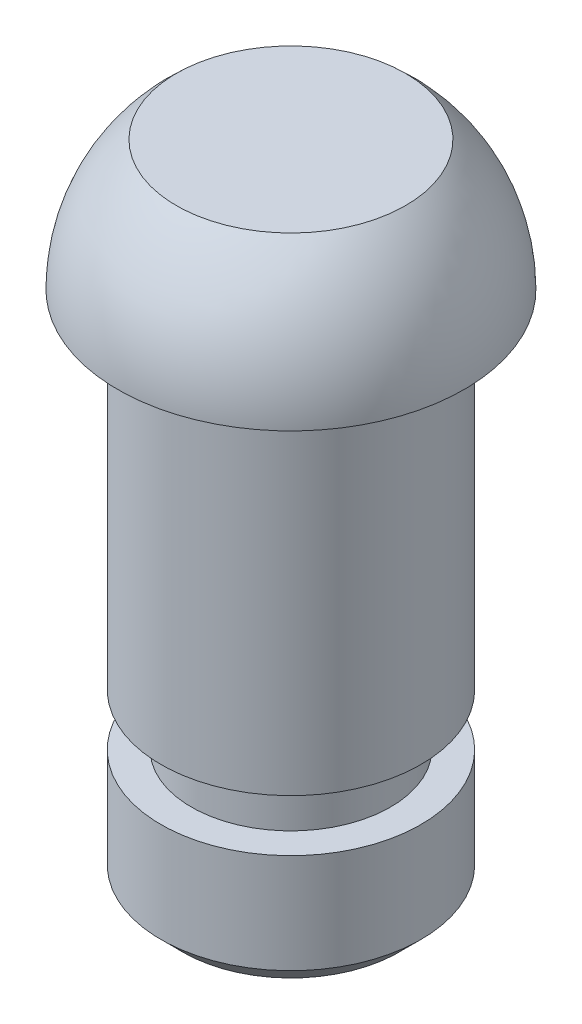
ISO-10303-21;
HEADER;
FILE_DESCRIPTION(('STEP AP214'),'2;1');
FILE_NAME('part.step','',(''),(''),'','','');
FILE_SCHEMA(('AUTOMOTIVE_DESIGN { 1 0 10303 214 1 1 1 1 }'));
ENDSEC;
DATA;
#1=APPLICATION_CONTEXT('core data for automotive mechanical design processes');
#2=APPLICATION_PROTOCOL_DEFINITION('international standard','automotive_design',2000,#1);
#3=PRODUCT_CONTEXT('',#1,'mechanical');
#4=PRODUCT('Part','Part','',(#3));
#5=PRODUCT_RELATED_PRODUCT_CATEGORY('part','',(#4));
#6=PRODUCT_DEFINITION_FORMATION('','',#4);
#7=PRODUCT_DEFINITION_CONTEXT('part definition',#1,'design');
#8=PRODUCT_DEFINITION('design','',#6,#7);
#9=PRODUCT_DEFINITION_SHAPE('','',#8);
#10=(LENGTH_UNIT() NAMED_UNIT(*) SI_UNIT(.MILLI.,.METRE.));
#11=(NAMED_UNIT(*) PLANE_ANGLE_UNIT() SI_UNIT($,.RADIAN.));
#12=(NAMED_UNIT(*) SI_UNIT($,.STERADIAN.) SOLID_ANGLE_UNIT());
#13=UNCERTAINTY_MEASURE_WITH_UNIT(LENGTH_MEASURE(1.E-05),#10,'distance_accuracy_value','');
#14=(GEOMETRIC_REPRESENTATION_CONTEXT(3) GLOBAL_UNCERTAINTY_ASSIGNED_CONTEXT((#13)) GLOBAL_UNIT_ASSIGNED_CONTEXT((#10,
#11,#12)) REPRESENTATION_CONTEXT('',''));
#15=CARTESIAN_POINT('',(0.,0.,0.));
#16=DIRECTION('',(0.,0.,1.));
#17=DIRECTION('',(1.,0.,0.));
#18=AXIS2_PLACEMENT_3D('',#15,#16,#17);
#19=CARTESIAN_POINT('',(1.5,0.,0.));
#20=DIRECTION('',(0.,-1.,0.));
#21=DIRECTION('',(0.,0.,-1.));
#22=AXIS2_PLACEMENT_3D('',#19,#20,#21);
#23=PLANE('',#22);
#24=CARTESIAN_POINT('',(0.,0.,0.));
#25=DIRECTION('',(0.,-1.,0.));
#26=DIRECTION('',(0.,0.,-1.));
#27=AXIS2_PLACEMENT_3D('',#24,#25,#26);
#28=CIRCLE('',#27,1.25);
#29=CARTESIAN_POINT('',(0.,0.,-1.25));
#30=VERTEX_POINT('',#29);
#31=EDGE_CURVE('E41',#30,#30,#28,.T.);
#32=ORIENTED_EDGE('',*,*,#31,.T.);
#33=EDGE_LOOP('',(#32));
#34=FACE_BOUND('',#33,.T.);
#35=ADVANCED_FACE('F33',(#34),#23,.T.);
#36=CARTESIAN_POINT('',(0.,0.,0.));
#37=DIRECTION('',(0.,-1.,0.));
#38=DIRECTION('',(0.,0.,-1.));
#39=AXIS2_PLACEMENT_3D('',#36,#37,#38);
#40=CYLINDRICAL_SURFACE('',#39,1.5);
#41=CARTESIAN_POINT('',(0.,0.25,0.));
#42=DIRECTION('',(0.,-1.,0.));
#43=DIRECTION('',(0.,0.,-1.));
#44=AXIS2_PLACEMENT_3D('',#41,#42,#43);
#45=CIRCLE('',#44,1.5);
#46=CARTESIAN_POINT('',(0.,0.25,-1.5));
#47=VERTEX_POINT('',#46);
#48=EDGE_CURVE('E10',#47,#47,#45,.F.);
#49=ORIENTED_EDGE('',*,*,#48,.T.);
#50=EDGE_LOOP('',(#49));
#51=FACE_BOUND('',#50,.T.);
#52=CARTESIAN_POINT('',(0.,1.4,0.));
#53=DIRECTION('',(0.,-1.,0.));
#54=DIRECTION('',(0.,0.,-1.));
#55=AXIS2_PLACEMENT_3D('',#52,#53,#54);
#56=CIRCLE('',#55,1.5);
#57=CARTESIAN_POINT('',(0.,1.4,-1.5));
#58=VERTEX_POINT('',#57);
#59=EDGE_CURVE('E45',#58,#58,#56,.T.);
#60=ORIENTED_EDGE('',*,*,#59,.T.);
#61=EDGE_LOOP('',(#60));
#62=FACE_BOUND('',#61,.T.);
#63=ADVANCED_FACE('F84',(#51,#62),#40,.T.);
#64=CARTESIAN_POINT('',(1.15,1.4,0.));
#65=DIRECTION('',(0.,1.,0.));
#66=DIRECTION('',(0.,0.,1.));
#67=AXIS2_PLACEMENT_3D('',#64,#65,#66);
#68=PLANE('',#67);
#69=CARTESIAN_POINT('',(0.,1.4,0.));
#70=DIRECTION('',(0.,-1.,0.));
#71=DIRECTION('',(0.,0.,-1.));
#72=AXIS2_PLACEMENT_3D('',#69,#70,#71);
#73=CIRCLE('',#72,1.15);
#74=CARTESIAN_POINT('',(0.,1.4,-1.15));
#75=VERTEX_POINT('',#74);
#76=EDGE_CURVE('E49',#75,#75,#73,.T.);
#77=ORIENTED_EDGE('',*,*,#76,.T.);
#78=EDGE_LOOP('',(#77));
#79=FACE_BOUND('',#78,.T.);
#80=ORIENTED_EDGE('',*,*,#59,.F.);
#81=EDGE_LOOP('',(#80));
#82=FACE_BOUND('',#81,.T.);
#83=ADVANCED_FACE('F88',(#79,#82),#68,.T.);
#84=CARTESIAN_POINT('',(0.,0.,0.));
#85=DIRECTION('',(0.,-1.,0.));
#86=DIRECTION('',(0.,0.,-1.));
#87=AXIS2_PLACEMENT_3D('',#84,#85,#86);
#88=CYLINDRICAL_SURFACE('',#87,1.15);
#89=CARTESIAN_POINT('',(0.,2.,0.));
#90=DIRECTION('',(0.,-1.,0.));
#91=DIRECTION('',(0.,0.,-1.));
#92=AXIS2_PLACEMENT_3D('',#89,#90,#91);
#93=CIRCLE('',#92,1.15);
#94=CARTESIAN_POINT('',(0.,2.,-1.15));
#95=VERTEX_POINT('',#94);
#96=EDGE_CURVE('E54',#95,#95,#93,.T.);
#97=ORIENTED_EDGE('',*,*,#96,.T.);
#98=EDGE_LOOP('',(#97));
#99=FACE_BOUND('',#98,.T.);
#100=ORIENTED_EDGE('',*,*,#76,.F.);
#101=EDGE_LOOP('',(#100));
#102=FACE_BOUND('',#101,.T.);
#103=ADVANCED_FACE('F93',(#99,#102),#88,.T.);
#104=CARTESIAN_POINT('',(1.5,2.,0.));
#105=DIRECTION('',(0.,-1.,0.));
#106=DIRECTION('',(0.,0.,-1.));
#107=AXIS2_PLACEMENT_3D('',#104,#105,#106);
#108=PLANE('',#107);
#109=CARTESIAN_POINT('',(0.,2.,0.));
#110=DIRECTION('',(0.,-1.,0.));
#111=DIRECTION('',(0.,0.,-1.));
#112=AXIS2_PLACEMENT_3D('',#109,#110,#111);
#113=CIRCLE('',#112,1.5);
#114=CARTESIAN_POINT('',(0.,2.,-1.5));
#115=VERTEX_POINT('',#114);
#116=EDGE_CURVE('E57',#115,#115,#113,.T.);
#117=ORIENTED_EDGE('',*,*,#116,.T.);
#118=EDGE_LOOP('',(#117));
#119=FACE_BOUND('',#118,.T.);
#120=ORIENTED_EDGE('',*,*,#96,.F.);
#121=EDGE_LOOP('',(#120));
#122=FACE_BOUND('',#121,.T.);
#123=ADVANCED_FACE('F97',(#119,#122),#108,.T.);
#124=CARTESIAN_POINT('',(0.,0.,0.));
#125=DIRECTION('',(0.,-1.,0.));
#126=DIRECTION('',(0.,0.,-1.));
#127=AXIS2_PLACEMENT_3D('',#124,#125,#126);
#128=CYLINDRICAL_SURFACE('',#127,1.5);
#129=CARTESIAN_POINT('',(0.,6.,0.));
#130=DIRECTION('',(0.,-1.,0.));
#131=DIRECTION('',(0.,0.,-1.));
#132=AXIS2_PLACEMENT_3D('',#129,#130,#131);
#133=CIRCLE('',#132,1.5);
#134=CARTESIAN_POINT('',(0.,6.,-1.5));
#135=VERTEX_POINT('',#134);
#136=EDGE_CURVE('E60',#135,#135,#133,.T.);
#137=ORIENTED_EDGE('',*,*,#136,.T.);
#138=EDGE_LOOP('',(#137));
#139=FACE_BOUND('',#138,.T.);
#140=ORIENTED_EDGE('',*,*,#116,.F.);
#141=EDGE_LOOP('',(#140));
#142=FACE_BOUND('',#141,.T.);
#143=ADVANCED_FACE('F101',(#139,#142),#128,.T.);
#144=CARTESIAN_POINT('',(1.5,6.,0.));
#145=DIRECTION('',(0.,-1.,0.));
#146=DIRECTION('',(0.,0.,-1.));
#147=AXIS2_PLACEMENT_3D('',#144,#145,#146);
#148=PLANE('',#147);
#149=CARTESIAN_POINT('',(0.,6.,0.));
#150=DIRECTION('',(0.,-1.,0.));
#151=DIRECTION('',(0.,0.,-1.));
#152=AXIS2_PLACEMENT_3D('',#149,#150,#151);
#153=CIRCLE('',#152,2.);
#154=CARTESIAN_POINT('',(0.,6.,-2.));
#155=VERTEX_POINT('',#154);
#156=EDGE_CURVE('E63',#155,#155,#153,.T.);
#157=ORIENTED_EDGE('',*,*,#156,.T.);
#158=EDGE_LOOP('',(#157));
#159=FACE_BOUND('',#158,.T.);
#160=ORIENTED_EDGE('',*,*,#136,.F.);
#161=EDGE_LOOP('',(#160));
#162=FACE_BOUND('',#161,.T.);
#163=ADVANCED_FACE('F81',(#159,#162),#148,.T.);
#164=CARTESIAN_POINT('',(0.,6.,0.));
#165=DIRECTION('',(0.,-1.,0.));
#166=DIRECTION('',(1.,0.,0.));
#167=AXIS2_PLACEMENT_3D('',#164,#165,#166);
#168=SPHERICAL_SURFACE('',#167,2.);
#169=CARTESIAN_POINT('',(0.,7.5,0.));
#170=DIRECTION('',(0.,-1.,0.));
#171=DIRECTION('',(0.,0.,-1.));
#172=AXIS2_PLACEMENT_3D('',#169,#170,#171);
#173=CIRCLE('',#172,1.3228756555323);
#174=CARTESIAN_POINT('',(0.,7.5,-1.3228756555323));
#175=VERTEX_POINT('',#174);
#176=EDGE_CURVE('E66',#175,#175,#173,.T.);
#177=ORIENTED_EDGE('',*,*,#176,.T.);
#178=EDGE_LOOP('',(#177));
#179=FACE_BOUND('',#178,.T.);
#180=ORIENTED_EDGE('',*,*,#156,.F.);
#181=EDGE_LOOP('',(#180));
#182=FACE_BOUND('',#181,.T.);
#183=ADVANCED_FACE('F70',(#179,#182),#168,.T.);
#184=CARTESIAN_POINT('',(0.,7.5,0.));
#185=DIRECTION('',(0.,1.,0.));
#186=DIRECTION('',(0.,0.,1.));
#187=AXIS2_PLACEMENT_3D('',#184,#185,#186);
#188=PLANE('',#187);
#189=ORIENTED_EDGE('',*,*,#176,.F.);
#190=EDGE_LOOP('',(#189));
#191=FACE_BOUND('',#190,.T.);
#192=ADVANCED_FACE('F73',(#191),#188,.T.);
#193=CARTESIAN_POINT('',(0.,0.,0.));
#194=DIRECTION('',(0.,1.,0.));
#195=DIRECTION('',(0.,0.,1.));
#196=AXIS2_PLACEMENT_3D('',#193,#194,#195);
#197=CONICAL_SURFACE('',#196,1.25,0.785398163397447);
#198=ORIENTED_EDGE('',*,*,#48,.F.);
#199=EDGE_LOOP('',(#198));
#200=FACE_BOUND('',#199,.T.);
#201=ORIENTED_EDGE('',*,*,#31,.F.);
#202=EDGE_LOOP('',(#201));
#203=FACE_BOUND('',#202,.T.);
#204=ADVANCED_FACE('F36',(#200,#203),#197,.T.);
#205=CLOSED_SHELL('',(#35,#63,#83,#103,#123,#143,#163,#183,#192,#204));
#206=MANIFOLD_SOLID_BREP('B2',#205);
#207=ADVANCED_BREP_SHAPE_REPRESENTATION('',(#18,#206),#14);
#208=SHAPE_DEFINITION_REPRESENTATION(#9,#207);
ENDSEC;
END-ISO-10303-21;
